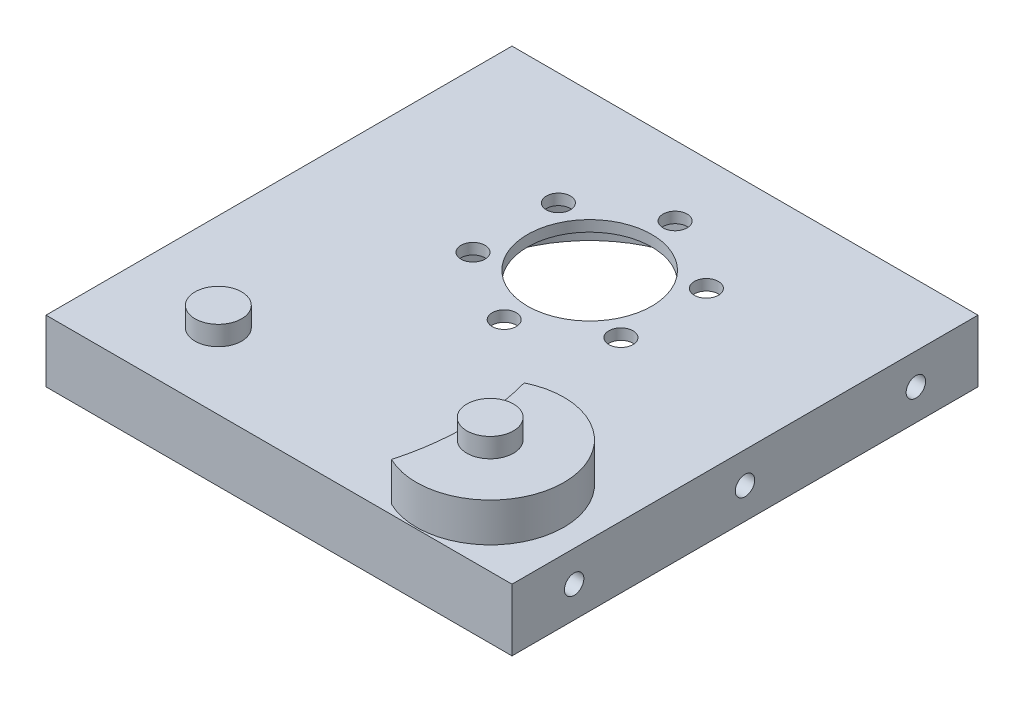
ISO-10303-21;
HEADER;
FILE_DESCRIPTION(('STEP AP214'),'2;1');
FILE_NAME('part.step','',(''),(''),'','','');
FILE_SCHEMA(('AUTOMOTIVE_DESIGN { 1 0 10303 214 1 1 1 1 }'));
ENDSEC;
DATA;
#1=APPLICATION_CONTEXT('core data for automotive mechanical design processes');
#2=APPLICATION_PROTOCOL_DEFINITION('international standard','automotive_design',2000,#1);
#3=PRODUCT_CONTEXT('',#1,'mechanical');
#4=PRODUCT('Part','Part','',(#3));
#5=PRODUCT_RELATED_PRODUCT_CATEGORY('part','',(#4));
#6=PRODUCT_DEFINITION_FORMATION('','',#4);
#7=PRODUCT_DEFINITION_CONTEXT('part definition',#1,'design');
#8=PRODUCT_DEFINITION('design','',#6,#7);
#9=PRODUCT_DEFINITION_SHAPE('','',#8);
#10=(LENGTH_UNIT() NAMED_UNIT(*) SI_UNIT(.MILLI.,.METRE.));
#11=(NAMED_UNIT(*) PLANE_ANGLE_UNIT() SI_UNIT($,.RADIAN.));
#12=(NAMED_UNIT(*) SI_UNIT($,.STERADIAN.) SOLID_ANGLE_UNIT());
#13=UNCERTAINTY_MEASURE_WITH_UNIT(LENGTH_MEASURE(1.E-05),#10,'distance_accuracy_value','');
#14=(GEOMETRIC_REPRESENTATION_CONTEXT(3) GLOBAL_UNCERTAINTY_ASSIGNED_CONTEXT((#13)) GLOBAL_UNIT_ASSIGNED_CONTEXT((#10,
#11,#12)) REPRESENTATION_CONTEXT('',''));
#15=CARTESIAN_POINT('',(0.,0.,0.));
#16=DIRECTION('',(0.,0.,1.));
#17=DIRECTION('',(1.,0.,0.));
#18=AXIS2_PLACEMENT_3D('',#15,#16,#17);
#19=CARTESIAN_POINT('',(0.,8.,-10.));
#20=DIRECTION('',(0.,-1.,0.));
#21=DIRECTION('',(0.,0.,-1.));
#22=AXIS2_PLACEMENT_3D('',#19,#20,#21);
#23=CYLINDRICAL_SURFACE('',#22,16.);
#24=CARTESIAN_POINT('',(0.,0.,-10.));
#25=DIRECTION('',(0.,1.,0.));
#26=DIRECTION('',(0.,0.,1.));
#27=AXIS2_PLACEMENT_3D('',#24,#25,#26);
#28=CIRCLE('',#27,16.);
#29=CARTESIAN_POINT('',(0.,0.,5.99999999999999));
#30=VERTEX_POINT('',#29);
#31=EDGE_CURVE('E245',#30,#30,#28,.T.);
#32=ORIENTED_EDGE('',*,*,#31,.F.);
#33=EDGE_LOOP('',(#32));
#34=FACE_BOUND('',#33,.T.);
#35=CARTESIAN_POINT('',(0.,6.6,-10.));
#36=DIRECTION('',(0.,1.,0.));
#37=DIRECTION('',(0.,0.,1.));
#38=AXIS2_PLACEMENT_3D('',#35,#36,#37);
#39=CIRCLE('',#38,16.);
#40=CARTESIAN_POINT('',(0.,6.6,5.99999999999998));
#41=VERTEX_POINT('',#40);
#42=EDGE_CURVE('E210',#41,#41,#39,.T.);
#43=ORIENTED_EDGE('',*,*,#42,.T.);
#44=EDGE_LOOP('',(#43));
#45=FACE_BOUND('',#44,.T.);
#46=ADVANCED_FACE('F45',(#34,#45),#23,.F.);
#47=CARTESIAN_POINT('',(0.,8.,0.));
#48=DIRECTION('',(0.,1.,0.));
#49=DIRECTION('',(0.,0.,1.));
#50=AXIS2_PLACEMENT_3D('',#47,#48,#49);
#51=PLANE('',#50);
#52=CARTESIAN_POINT('',(9.52627944162876,8.,-15.5000000000001));
#53=DIRECTION('',(0.,1.,0.));
#54=DIRECTION('',(-0.866025403784433,0.,0.50000000000001));
#55=AXIS2_PLACEMENT_3D('',#52,#53,#54);
#56=CIRCLE('',#55,1.55);
#57=CARTESIAN_POINT('',(8.18394006576289,8.,-14.7250000000001));
#58=VERTEX_POINT('',#57);
#59=EDGE_CURVE('E180',#58,#58,#56,.T.);
#60=ORIENTED_EDGE('',*,*,#59,.F.);
#61=EDGE_LOOP('',(#60));
#62=FACE_BOUND('',#61,.T.);
#63=CARTESIAN_POINT('',(9.52627944162887,8.,-4.50000000000009));
#64=DIRECTION('',(0.,1.,0.));
#65=DIRECTION('',(-0.866025403784443,0.,-0.499999999999992));
#66=AXIS2_PLACEMENT_3D('',#63,#64,#65);
#67=CIRCLE('',#66,1.55);
#68=CARTESIAN_POINT('',(8.18394006576298,8.,-5.27500000000007));
#69=VERTEX_POINT('',#68);
#70=EDGE_CURVE('E190',#69,#69,#67,.T.);
#71=ORIENTED_EDGE('',*,*,#70,.F.);
#72=EDGE_LOOP('',(#71));
#73=FACE_BOUND('',#72,.T.);
#74=CARTESIAN_POINT('',(0.,8.,0.999999999999994));
#75=DIRECTION('',(0.,1.,0.));
#76=DIRECTION('',(0.,0.,-1.));
#77=AXIS2_PLACEMENT_3D('',#74,#75,#76);
#78=CIRCLE('',#77,1.55);
#79=CARTESIAN_POINT('',(0.,8.,-0.550000000000005));
#80=VERTEX_POINT('',#79);
#81=EDGE_CURVE('E186',#80,#80,#78,.T.);
#82=ORIENTED_EDGE('',*,*,#81,.F.);
#83=EDGE_LOOP('',(#82));
#84=FACE_BOUND('',#83,.T.);
#85=CARTESIAN_POINT('',(-9.52627944162881,8.,-4.49999999999997));
#86=DIRECTION('',(0.,1.,0.));
#87=DIRECTION('',(0.866025403784436,0.,-0.500000000000004));
#88=AXIS2_PLACEMENT_3D('',#85,#86,#87);
#89=CIRCLE('',#88,1.55);
#90=CARTESIAN_POINT('',(-8.18394006576294,8.,-5.27499999999997));
#91=VERTEX_POINT('',#90);
#92=EDGE_CURVE('E181',#91,#91,#89,.T.);
#93=ORIENTED_EDGE('',*,*,#92,.F.);
#94=EDGE_LOOP('',(#93));
#95=FACE_BOUND('',#94,.T.);
#96=CARTESIAN_POINT('',(-9.52627944162884,8.,-15.5));
#97=DIRECTION('',(0.,1.,0.));
#98=DIRECTION('',(0.86602540378444,0.,0.499999999999998));
#99=AXIS2_PLACEMENT_3D('',#96,#97,#98);
#100=CIRCLE('',#99,1.55);
#101=CARTESIAN_POINT('',(-8.18394006576296,8.,-14.725));
#102=VERTEX_POINT('',#101);
#103=EDGE_CURVE('E185',#102,#102,#100,.T.);
#104=ORIENTED_EDGE('',*,*,#103,.F.);
#105=EDGE_LOOP('',(#104));
#106=FACE_BOUND('',#105,.T.);
#107=CARTESIAN_POINT('',(0.,8.,-21.));
#108=DIRECTION('',(0.,1.,0.));
#109=DIRECTION('',(0.,0.,1.));
#110=AXIS2_PLACEMENT_3D('',#107,#108,#109);
#111=CIRCLE('',#110,1.55);
#112=CARTESIAN_POINT('',(0.,8.,-19.45));
#113=VERTEX_POINT('',#112);
#114=EDGE_CURVE('E201',#113,#113,#111,.T.);
#115=ORIENTED_EDGE('',*,*,#114,.F.);
#116=EDGE_LOOP('',(#115));
#117=FACE_BOUND('',#116,.T.);
#118=CARTESIAN_POINT('',(17.5,8.,20.3108891324554));
#119=DIRECTION('',(0.,1.,0.));
#120=DIRECTION('',(0.,0.,1.));
#121=AXIS2_PLACEMENT_3D('',#118,#119,#120);
#122=CIRCLE('',#121,9.5);
#123=CARTESIAN_POINT('',(13.3392857142857,8.,28.8512905652132));
#124=VERTEX_POINT('',#123);
#125=CARTESIAN_POINT('',(13.3392857142857,8.,11.7704876996975));
#126=VERTEX_POINT('',#125);
#127=EDGE_CURVE('E228',#124,#126,#122,.T.);
#128=ORIENTED_EDGE('',*,*,#127,.F.);
#129=CARTESIAN_POINT('',(-17.5,8.,20.3108891324554));
#130=DIRECTION('',(0.,-1.,0.));
#131=DIRECTION('',(0.,0.,1.));
#132=AXIS2_PLACEMENT_3D('',#129,#130,#131);
#133=CIRCLE('',#132,32.);
#134=EDGE_CURVE('E218',#126,#124,#133,.T.);
#135=ORIENTED_EDGE('',*,*,#134,.F.);
#136=EDGE_LOOP('',(#128,#135));
#137=FACE_BOUND('',#136,.T.);
#138=CARTESIAN_POINT('',(-17.5,8.,20.3108891324554));
#139=DIRECTION('',(0.,1.,0.));
#140=DIRECTION('',(0.,0.,1.));
#141=AXIS2_PLACEMENT_3D('',#138,#139,#140);
#142=CIRCLE('',#141,3.);
#143=CARTESIAN_POINT('',(-17.5,8.,23.3108891324554));
#144=VERTEX_POINT('',#143);
#145=EDGE_CURVE('E240',#144,#144,#142,.T.);
#146=ORIENTED_EDGE('',*,*,#145,.F.);
#147=EDGE_LOOP('',(#146));
#148=FACE_BOUND('',#147,.T.);
#149=DIRECTION('',(0.,0.,-1.));
#150=VECTOR('',#149,1.);
#151=CARTESIAN_POINT('',(30.,8.,-30.));
#152=LINE('',#151,#150);
#153=CARTESIAN_POINT('',(30.,8.,30.));
#154=VERTEX_POINT('',#153);
#155=CARTESIAN_POINT('',(30.,8.,-30.));
#156=VERTEX_POINT('',#155);
#157=EDGE_CURVE('E253',#154,#156,#152,.T.);
#158=ORIENTED_EDGE('',*,*,#157,.T.);
#159=DIRECTION('',(-1.,0.,0.));
#160=VECTOR('',#159,1.);
#161=CARTESIAN_POINT('',(-30.,8.,-30.));
#162=LINE('',#161,#160);
#163=CARTESIAN_POINT('',(-30.,8.,-30.));
#164=VERTEX_POINT('',#163);
#165=EDGE_CURVE('E257',#156,#164,#162,.T.);
#166=ORIENTED_EDGE('',*,*,#165,.T.);
#167=DIRECTION('',(0.,0.,1.));
#168=VECTOR('',#167,1.);
#169=CARTESIAN_POINT('',(-30.,8.,-30.));
#170=LINE('',#169,#168);
#171=CARTESIAN_POINT('',(-30.,8.,30.));
#172=VERTEX_POINT('',#171);
#173=EDGE_CURVE('E261',#164,#172,#170,.T.);
#174=ORIENTED_EDGE('',*,*,#173,.T.);
#175=DIRECTION('',(1.,0.,0.));
#176=VECTOR('',#175,1.);
#177=CARTESIAN_POINT('',(-30.,8.,30.));
#178=LINE('',#177,#176);
#179=EDGE_CURVE('E264',#172,#154,#178,.T.);
#180=ORIENTED_EDGE('',*,*,#179,.T.);
#181=EDGE_LOOP('',(#158,#166,#174,#180));
#182=FACE_BOUND('',#181,.T.);
#183=CARTESIAN_POINT('',(0.,8.,-10.));
#184=DIRECTION('',(0.,1.,0.));
#185=DIRECTION('',(0.,0.,1.));
#186=AXIS2_PLACEMENT_3D('',#183,#184,#185);
#187=CIRCLE('',#186,8.);
#188=CARTESIAN_POINT('',(0.,8.,-2.00000000000001));
#189=VERTEX_POINT('',#188);
#190=EDGE_CURVE('E211',#189,#189,#187,.T.);
#191=ORIENTED_EDGE('',*,*,#190,.F.);
#192=EDGE_LOOP('',(#191));
#193=FACE_BOUND('',#192,.T.);
#194=ADVANCED_FACE('F335',(#62,#73,#84,#95,#106,#117,#137,#148,#182,#193),#51,.T.);
#195=CARTESIAN_POINT('',(0.,0.,0.));
#196=DIRECTION('',(0.,1.,0.));
#197=DIRECTION('',(0.,0.,1.));
#198=AXIS2_PLACEMENT_3D('',#195,#196,#197);
#199=PLANE('',#198);
#200=DIRECTION('',(0.,0.,-1.));
#201=VECTOR('',#200,1.);
#202=CARTESIAN_POINT('',(30.,0.,-30.));
#203=LINE('',#202,#201);
#204=CARTESIAN_POINT('',(30.,0.,30.));
#205=VERTEX_POINT('',#204);
#206=CARTESIAN_POINT('',(30.,0.,-30.));
#207=VERTEX_POINT('',#206);
#208=EDGE_CURVE('E252',#205,#207,#203,.T.);
#209=ORIENTED_EDGE('',*,*,#208,.F.);
#210=DIRECTION('',(1.,0.,0.));
#211=VECTOR('',#210,1.);
#212=CARTESIAN_POINT('',(-30.,0.,30.));
#213=LINE('',#212,#211);
#214=CARTESIAN_POINT('',(-30.,0.,30.));
#215=VERTEX_POINT('',#214);
#216=EDGE_CURVE('E258',#215,#205,#213,.T.);
#217=ORIENTED_EDGE('',*,*,#216,.F.);
#218=DIRECTION('',(0.,0.,1.));
#219=VECTOR('',#218,1.);
#220=CARTESIAN_POINT('',(-30.,0.,-30.));
#221=LINE('',#220,#219);
#222=CARTESIAN_POINT('',(-30.,0.,-30.));
#223=VERTEX_POINT('',#222);
#224=EDGE_CURVE('E274',#223,#215,#221,.T.);
#225=ORIENTED_EDGE('',*,*,#224,.F.);
#226=DIRECTION('',(-1.,0.,0.));
#227=VECTOR('',#226,1.);
#228=CARTESIAN_POINT('',(-30.,0.,-30.));
#229=LINE('',#228,#227);
#230=EDGE_CURVE('E271',#207,#223,#229,.T.);
#231=ORIENTED_EDGE('',*,*,#230,.F.);
#232=EDGE_LOOP('',(#209,#217,#225,#231));
#233=FACE_BOUND('',#232,.T.);
#234=ORIENTED_EDGE('',*,*,#31,.T.);
#235=EDGE_LOOP('',(#234));
#236=FACE_BOUND('',#235,.T.);
#237=ADVANCED_FACE('F341',(#233,#236),#199,.F.);
#238=CARTESIAN_POINT('',(30.,8.,-30.));
#239=DIRECTION('',(-1.,0.,0.));
#240=DIRECTION('',(0.,0.,1.));
#241=AXIS2_PLACEMENT_3D('',#238,#239,#240);
#242=PLANE('',#241);
#243=CARTESIAN_POINT('',(30.,4.,22.));
#244=DIRECTION('',(1.,0.,0.));
#245=DIRECTION('',(0.,0.,-1.));
#246=AXIS2_PLACEMENT_3D('',#243,#244,#245);
#247=CIRCLE('',#246,1.25);
#248=CARTESIAN_POINT('',(30.,4.,20.75));
#249=VERTEX_POINT('',#248);
#250=EDGE_CURVE('E156',#249,#249,#247,.T.);
#251=ORIENTED_EDGE('',*,*,#250,.F.);
#252=EDGE_LOOP('',(#251));
#253=FACE_BOUND('',#252,.T.);
#254=CARTESIAN_POINT('',(30.,4.,0.));
#255=DIRECTION('',(1.,0.,0.));
#256=DIRECTION('',(0.,0.,-1.));
#257=AXIS2_PLACEMENT_3D('',#254,#255,#256);
#258=CIRCLE('',#257,1.25);
#259=CARTESIAN_POINT('',(30.,4.,-1.25));
#260=VERTEX_POINT('',#259);
#261=EDGE_CURVE('E164',#260,#260,#258,.T.);
#262=ORIENTED_EDGE('',*,*,#261,.F.);
#263=EDGE_LOOP('',(#262));
#264=FACE_BOUND('',#263,.T.);
#265=CARTESIAN_POINT('',(30.,4.,-22.));
#266=DIRECTION('',(1.,0.,0.));
#267=DIRECTION('',(0.,0.,-1.));
#268=AXIS2_PLACEMENT_3D('',#265,#266,#267);
#269=CIRCLE('',#268,1.25);
#270=CARTESIAN_POINT('',(30.,4.,-23.25));
#271=VERTEX_POINT('',#270);
#272=EDGE_CURVE('E172',#271,#271,#269,.T.);
#273=ORIENTED_EDGE('',*,*,#272,.F.);
#274=EDGE_LOOP('',(#273));
#275=FACE_BOUND('',#274,.T.);
#276=ORIENTED_EDGE('',*,*,#208,.T.);
#277=DIRECTION('',(0.,-1.,0.));
#278=VECTOR('',#277,1.);
#279=CARTESIAN_POINT('',(30.,8.,-30.));
#280=LINE('',#279,#278);
#281=EDGE_CURVE('E55',#156,#207,#280,.T.);
#282=ORIENTED_EDGE('',*,*,#281,.F.);
#283=ORIENTED_EDGE('',*,*,#157,.F.);
#284=DIRECTION('',(0.,-1.,0.));
#285=VECTOR('',#284,1.);
#286=CARTESIAN_POINT('',(30.,8.,30.));
#287=LINE('',#286,#285);
#288=EDGE_CURVE('E267',#154,#205,#287,.T.);
#289=ORIENTED_EDGE('',*,*,#288,.T.);
#290=EDGE_LOOP('',(#276,#282,#283,#289));
#291=FACE_BOUND('',#290,.T.);
#292=ADVANCED_FACE('F47',(#253,#264,#275,#291),#242,.F.);
#293=CARTESIAN_POINT('',(-30.,8.,-30.));
#294=DIRECTION('',(0.,0.,1.));
#295=DIRECTION('',(1.,0.,0.));
#296=AXIS2_PLACEMENT_3D('',#293,#294,#295);
#297=PLANE('',#296);
#298=ORIENTED_EDGE('',*,*,#230,.T.);
#299=DIRECTION('',(0.,-1.,0.));
#300=VECTOR('',#299,1.);
#301=CARTESIAN_POINT('',(-30.,8.,-30.));
#302=LINE('',#301,#300);
#303=EDGE_CURVE('E286',#164,#223,#302,.T.);
#304=ORIENTED_EDGE('',*,*,#303,.F.);
#305=ORIENTED_EDGE('',*,*,#165,.F.);
#306=ORIENTED_EDGE('',*,*,#281,.T.);
#307=EDGE_LOOP('',(#298,#304,#305,#306));
#308=FACE_BOUND('',#307,.T.);
#309=ADVANCED_FACE('F359',(#308),#297,.F.);
#310=CARTESIAN_POINT('',(-30.,8.,-30.));
#311=DIRECTION('',(1.,0.,0.));
#312=DIRECTION('',(0.,0.,-1.));
#313=AXIS2_PLACEMENT_3D('',#310,#311,#312);
#314=PLANE('',#313);
#315=CARTESIAN_POINT('',(-30.,4.,22.));
#316=DIRECTION('',(-1.,0.,0.));
#317=DIRECTION('',(0.,0.,1.));
#318=AXIS2_PLACEMENT_3D('',#315,#316,#317);
#319=CIRCLE('',#318,1.25);
#320=CARTESIAN_POINT('',(-30.,4.,23.25));
#321=VERTEX_POINT('',#320);
#322=EDGE_CURVE('E135',#321,#321,#319,.T.);
#323=ORIENTED_EDGE('',*,*,#322,.F.);
#324=EDGE_LOOP('',(#323));
#325=FACE_BOUND('',#324,.T.);
#326=CARTESIAN_POINT('',(-30.,4.,0.));
#327=DIRECTION('',(-1.,0.,0.));
#328=DIRECTION('',(0.,0.,1.));
#329=AXIS2_PLACEMENT_3D('',#326,#327,#328);
#330=CIRCLE('',#329,1.25);
#331=CARTESIAN_POINT('',(-30.,4.,1.25));
#332=VERTEX_POINT('',#331);
#333=EDGE_CURVE('E134',#332,#332,#330,.T.);
#334=ORIENTED_EDGE('',*,*,#333,.F.);
#335=EDGE_LOOP('',(#334));
#336=FACE_BOUND('',#335,.T.);
#337=CARTESIAN_POINT('',(-30.,4.,-22.));
#338=DIRECTION('',(-1.,0.,0.));
#339=DIRECTION('',(0.,0.,1.));
#340=AXIS2_PLACEMENT_3D('',#337,#338,#339);
#341=CIRCLE('',#340,1.25);
#342=CARTESIAN_POINT('',(-30.,4.,-20.75));
#343=VERTEX_POINT('',#342);
#344=EDGE_CURVE('E148',#343,#343,#341,.T.);
#345=ORIENTED_EDGE('',*,*,#344,.F.);
#346=EDGE_LOOP('',(#345));
#347=FACE_BOUND('',#346,.T.);
#348=ORIENTED_EDGE('',*,*,#224,.T.);
#349=DIRECTION('',(0.,-1.,0.));
#350=VECTOR('',#349,1.);
#351=CARTESIAN_POINT('',(-30.,8.,30.));
#352=LINE('',#351,#350);
#353=EDGE_CURVE('E282',#172,#215,#352,.T.);
#354=ORIENTED_EDGE('',*,*,#353,.F.);
#355=ORIENTED_EDGE('',*,*,#173,.F.);
#356=ORIENTED_EDGE('',*,*,#303,.T.);
#357=EDGE_LOOP('',(#348,#354,#355,#356));
#358=FACE_BOUND('',#357,.T.);
#359=ADVANCED_FACE('F356',(#325,#336,#347,#358),#314,.F.);
#360=CARTESIAN_POINT('',(-30.,8.,30.));
#361=DIRECTION('',(0.,0.,-1.));
#362=DIRECTION('',(-1.,0.,0.));
#363=AXIS2_PLACEMENT_3D('',#360,#361,#362);
#364=PLANE('',#363);
#365=ORIENTED_EDGE('',*,*,#216,.T.);
#366=ORIENTED_EDGE('',*,*,#288,.F.);
#367=ORIENTED_EDGE('',*,*,#179,.F.);
#368=ORIENTED_EDGE('',*,*,#353,.T.);
#369=EDGE_LOOP('',(#365,#366,#367,#368));
#370=FACE_BOUND('',#369,.T.);
#371=ADVANCED_FACE('F353',(#370),#364,.F.);
#372=CARTESIAN_POINT('',(-17.5,10.5,20.3108891324554));
#373=DIRECTION('',(0.,-1.,0.));
#374=DIRECTION('',(0.,0.,-1.));
#375=AXIS2_PLACEMENT_3D('',#372,#373,#374);
#376=CYLINDRICAL_SURFACE('',#375,3.);
#377=CARTESIAN_POINT('',(-17.5,10.5,20.3108891324554));
#378=DIRECTION('',(0.,1.,0.));
#379=DIRECTION('',(0.,0.,1.));
#380=AXIS2_PLACEMENT_3D('',#377,#378,#379);
#381=CIRCLE('',#380,3.);
#382=CARTESIAN_POINT('',(-17.5,10.5,23.3108891324554));
#383=VERTEX_POINT('',#382);
#384=EDGE_CURVE('E241',#383,#383,#381,.T.);
#385=ORIENTED_EDGE('',*,*,#384,.F.);
#386=EDGE_LOOP('',(#385));
#387=FACE_BOUND('',#386,.T.);
#388=ORIENTED_EDGE('',*,*,#145,.T.);
#389=EDGE_LOOP('',(#388));
#390=FACE_BOUND('',#389,.T.);
#391=ADVANCED_FACE('F347',(#387,#390),#376,.T.);
#392=CARTESIAN_POINT('',(-17.5,10.5,20.3108891324554));
#393=DIRECTION('',(0.,1.,0.));
#394=DIRECTION('',(0.,0.,1.));
#395=AXIS2_PLACEMENT_3D('',#392,#393,#394);
#396=PLANE('',#395);
#397=ORIENTED_EDGE('',*,*,#384,.T.);
#398=EDGE_LOOP('',(#397));
#399=FACE_BOUND('',#398,.T.);
#400=ADVANCED_FACE('F410',(#399),#396,.T.);
#401=CARTESIAN_POINT('',(-17.5,13.,20.3108891324554));
#402=DIRECTION('',(0.,-1.,0.));
#403=DIRECTION('',(0.,0.,-1.));
#404=AXIS2_PLACEMENT_3D('',#401,#402,#403);
#405=CYLINDRICAL_SURFACE('',#404,32.);
#406=CARTESIAN_POINT('',(-17.5,13.,20.3108891324554));
#407=DIRECTION('',(0.,-1.,0.));
#408=DIRECTION('',(0.,0.,1.));
#409=AXIS2_PLACEMENT_3D('',#406,#407,#408);
#410=CIRCLE('',#409,32.);
#411=CARTESIAN_POINT('',(14.5,13.,20.3108891324554));
#412=VERTEX_POINT('',#411);
#413=CARTESIAN_POINT('',(13.3392857142857,13.,28.8512905652132));
#414=VERTEX_POINT('',#413);
#415=EDGE_CURVE('E222',#412,#414,#410,.T.);
#416=ORIENTED_EDGE('',*,*,#415,.F.);
#417=CARTESIAN_POINT('',(13.3392857142857,13.,11.7704876996975));
#418=VERTEX_POINT('',#417);
#419=EDGE_CURVE('E71',#418,#412,#410,.T.);
#420=ORIENTED_EDGE('',*,*,#419,.F.);
#421=DIRECTION('',(0.,-1.,0.));
#422=VECTOR('',#421,1.);
#423=CARTESIAN_POINT('',(13.3392857142857,13.,11.7704876996975));
#424=LINE('',#423,#422);
#425=EDGE_CURVE('E225',#418,#126,#424,.T.);
#426=ORIENTED_EDGE('',*,*,#425,.T.);
#427=ORIENTED_EDGE('',*,*,#134,.T.);
#428=DIRECTION('',(0.,-1.,0.));
#429=VECTOR('',#428,1.);
#430=CARTESIAN_POINT('',(13.3392857142857,13.,28.8512905652132));
#431=LINE('',#430,#429);
#432=EDGE_CURVE('E63',#414,#124,#431,.T.);
#433=ORIENTED_EDGE('',*,*,#432,.F.);
#434=EDGE_LOOP('',(#416,#420,#426,#427,#433));
#435=FACE_BOUND('',#434,.T.);
#436=ADVANCED_FACE('F407',(#435),#405,.F.);
#437=CARTESIAN_POINT('',(17.5,13.,20.3108891324554));
#438=DIRECTION('',(0.,-1.,0.));
#439=DIRECTION('',(0.,0.,-1.));
#440=AXIS2_PLACEMENT_3D('',#437,#438,#439);
#441=CYLINDRICAL_SURFACE('',#440,9.5);
#442=ORIENTED_EDGE('',*,*,#127,.T.);
#443=ORIENTED_EDGE('',*,*,#425,.F.);
#444=CARTESIAN_POINT('',(17.5,13.,20.3108891324554));
#445=DIRECTION('',(0.,1.,0.));
#446=DIRECTION('',(0.,0.,1.));
#447=AXIS2_PLACEMENT_3D('',#444,#445,#446);
#448=CIRCLE('',#447,9.5);
#449=EDGE_CURVE('E221',#414,#418,#448,.T.);
#450=ORIENTED_EDGE('',*,*,#449,.F.);
#451=ORIENTED_EDGE('',*,*,#432,.T.);
#452=EDGE_LOOP('',(#442,#443,#450,#451));
#453=FACE_BOUND('',#452,.T.);
#454=ADVANCED_FACE('F404',(#453),#441,.T.);
#455=CARTESIAN_POINT('',(0.,13.,20.3108891324554));
#456=DIRECTION('',(0.,1.,0.));
#457=DIRECTION('',(0.,0.,1.));
#458=AXIS2_PLACEMENT_3D('',#455,#456,#457);
#459=PLANE('',#458);
#460=ORIENTED_EDGE('',*,*,#419,.T.);
#461=CARTESIAN_POINT('',(17.5,13.,20.3108891324554));
#462=DIRECTION('',(0.,1.,0.));
#463=DIRECTION('',(0.,0.,1.));
#464=AXIS2_PLACEMENT_3D('',#461,#462,#463);
#465=CIRCLE('',#464,2.99999999999999);
#466=EDGE_CURVE('E11',#412,#412,#465,.T.);
#467=ORIENTED_EDGE('',*,*,#466,.F.);
#468=ORIENTED_EDGE('',*,*,#415,.T.);
#469=ORIENTED_EDGE('',*,*,#449,.T.);
#470=EDGE_LOOP('',(#460,#467,#468,#469));
#471=FACE_BOUND('',#470,.T.);
#472=ADVANCED_FACE('F400',(#471),#459,.T.);
#473=CARTESIAN_POINT('',(17.5,15.5,20.3108891324554));
#474=DIRECTION('',(0.,1.,0.));
#475=DIRECTION('',(0.,0.,1.));
#476=AXIS2_PLACEMENT_3D('',#473,#474,#475);
#477=PLANE('',#476);
#478=CARTESIAN_POINT('',(17.5,15.5,20.3108891324554));
#479=DIRECTION('',(0.,1.,0.));
#480=DIRECTION('',(0.,0.,1.));
#481=AXIS2_PLACEMENT_3D('',#478,#479,#480);
#482=CIRCLE('',#481,2.99999999999999);
#483=CARTESIAN_POINT('',(17.5,15.5,23.3108891324553));
#484=VERTEX_POINT('',#483);
#485=EDGE_CURVE('E236',#484,#484,#482,.T.);
#486=ORIENTED_EDGE('',*,*,#485,.T.);
#487=EDGE_LOOP('',(#486));
#488=FACE_BOUND('',#487,.T.);
#489=ADVANCED_FACE('F403',(#488),#477,.T.);
#490=CARTESIAN_POINT('',(17.5,10.5,20.3108891324554));
#491=DIRECTION('',(0.,-1.,0.));
#492=DIRECTION('',(0.,0.,-1.));
#493=AXIS2_PLACEMENT_3D('',#490,#491,#492);
#494=CYLINDRICAL_SURFACE('',#493,2.99999999999999);
#495=ORIENTED_EDGE('',*,*,#466,.T.);
#496=EDGE_LOOP('',(#495));
#497=FACE_BOUND('',#496,.T.);
#498=ORIENTED_EDGE('',*,*,#485,.F.);
#499=EDGE_LOOP('',(#498));
#500=FACE_BOUND('',#499,.T.);
#501=ADVANCED_FACE('F396',(#497,#500),#494,.T.);
#502=CARTESIAN_POINT('',(0.,6.6,-10.));
#503=DIRECTION('',(0.,1.,0.));
#504=DIRECTION('',(0.,0.,1.));
#505=AXIS2_PLACEMENT_3D('',#502,#503,#504);
#506=PLANE('',#505);
#507=CARTESIAN_POINT('',(9.52627944162876,6.6,-15.5000000000001));
#508=DIRECTION('',(0.,1.,0.));
#509=DIRECTION('',(0.,0.,1.));
#510=AXIS2_PLACEMENT_3D('',#507,#508,#509);
#511=CIRCLE('',#510,1.55);
#512=CARTESIAN_POINT('',(9.52627944162876,6.6,-13.9500000000001));
#513=VERTEX_POINT('',#512);
#514=EDGE_CURVE('E49',#513,#513,#511,.T.);
#515=ORIENTED_EDGE('',*,*,#514,.T.);
#516=EDGE_LOOP('',(#515));
#517=FACE_BOUND('',#516,.T.);
#518=CARTESIAN_POINT('',(9.52627944162887,6.6,-4.50000000000009));
#519=DIRECTION('',(0.,1.,0.));
#520=DIRECTION('',(0.,0.,1.));
#521=AXIS2_PLACEMENT_3D('',#518,#519,#520);
#522=CIRCLE('',#521,1.55);
#523=CARTESIAN_POINT('',(9.52627944162887,6.6,-2.95000000000009));
#524=VERTEX_POINT('',#523);
#525=EDGE_CURVE('E306',#524,#524,#522,.T.);
#526=ORIENTED_EDGE('',*,*,#525,.T.);
#527=EDGE_LOOP('',(#526));
#528=FACE_BOUND('',#527,.T.);
#529=CARTESIAN_POINT('',(0.,6.6,0.999999999999994));
#530=DIRECTION('',(0.,1.,0.));
#531=DIRECTION('',(0.,0.,1.));
#532=AXIS2_PLACEMENT_3D('',#529,#530,#531);
#533=CIRCLE('',#532,1.55);
#534=CARTESIAN_POINT('',(0.,6.6,2.54999999999999));
#535=VERTEX_POINT('',#534);
#536=EDGE_CURVE('E303',#535,#535,#533,.T.);
#537=ORIENTED_EDGE('',*,*,#536,.T.);
#538=EDGE_LOOP('',(#537));
#539=FACE_BOUND('',#538,.T.);
#540=CARTESIAN_POINT('',(-9.52627944162881,6.6,-4.49999999999997));
#541=DIRECTION('',(0.,1.,0.));
#542=DIRECTION('',(0.,0.,1.));
#543=AXIS2_PLACEMENT_3D('',#540,#541,#542);
#544=CIRCLE('',#543,1.55);
#545=CARTESIAN_POINT('',(-9.52627944162881,6.6,-2.94999999999997));
#546=VERTEX_POINT('',#545);
#547=EDGE_CURVE('E299',#546,#546,#544,.T.);
#548=ORIENTED_EDGE('',*,*,#547,.T.);
#549=EDGE_LOOP('',(#548));
#550=FACE_BOUND('',#549,.T.);
#551=CARTESIAN_POINT('',(-9.52627944162884,6.6,-15.5));
#552=DIRECTION('',(0.,1.,0.));
#553=DIRECTION('',(0.,0.,1.));
#554=AXIS2_PLACEMENT_3D('',#551,#552,#553);
#555=CIRCLE('',#554,1.55);
#556=CARTESIAN_POINT('',(-9.52627944162884,6.6,-13.95));
#557=VERTEX_POINT('',#556);
#558=EDGE_CURVE('E200',#557,#557,#555,.T.);
#559=ORIENTED_EDGE('',*,*,#558,.T.);
#560=EDGE_LOOP('',(#559));
#561=FACE_BOUND('',#560,.T.);
#562=CARTESIAN_POINT('',(0.,6.6,-21.));
#563=DIRECTION('',(0.,1.,0.));
#564=DIRECTION('',(0.,0.,1.));
#565=AXIS2_PLACEMENT_3D('',#562,#563,#564);
#566=CIRCLE('',#565,1.55);
#567=CARTESIAN_POINT('',(0.,6.6,-19.45));
#568=VERTEX_POINT('',#567);
#569=EDGE_CURVE('E205',#568,#568,#566,.T.);
#570=ORIENTED_EDGE('',*,*,#569,.T.);
#571=EDGE_LOOP('',(#570));
#572=FACE_BOUND('',#571,.T.);
#573=CARTESIAN_POINT('',(0.,6.6,-10.));
#574=DIRECTION('',(0.,1.,0.));
#575=DIRECTION('',(0.,0.,1.));
#576=AXIS2_PLACEMENT_3D('',#573,#574,#575);
#577=CIRCLE('',#576,8.);
#578=CARTESIAN_POINT('',(0.,6.6,-2.00000000000001));
#579=VERTEX_POINT('',#578);
#580=EDGE_CURVE('E206',#579,#579,#577,.T.);
#581=ORIENTED_EDGE('',*,*,#580,.T.);
#582=EDGE_LOOP('',(#581));
#583=FACE_BOUND('',#582,.T.);
#584=ORIENTED_EDGE('',*,*,#42,.F.);
#585=EDGE_LOOP('',(#584));
#586=FACE_BOUND('',#585,.T.);
#587=ADVANCED_FACE('F315',(#517,#528,#539,#550,#561,#572,#583,#586),#506,.F.);
#588=CARTESIAN_POINT('',(0.,6.6,-10.));
#589=DIRECTION('',(0.,1.,0.));
#590=DIRECTION('',(0.,0.,1.));
#591=AXIS2_PLACEMENT_3D('',#588,#589,#590);
#592=CYLINDRICAL_SURFACE('',#591,8.);
#593=ORIENTED_EDGE('',*,*,#580,.F.);
#594=EDGE_LOOP('',(#593));
#595=FACE_BOUND('',#594,.T.);
#596=ORIENTED_EDGE('',*,*,#190,.T.);
#597=EDGE_LOOP('',(#596));
#598=FACE_BOUND('',#597,.T.);
#599=ADVANCED_FACE('F384',(#595,#598),#592,.F.);
#600=CARTESIAN_POINT('',(0.,0.,-21.));
#601=DIRECTION('',(0.,1.,0.));
#602=DIRECTION('',(0.,0.,1.));
#603=AXIS2_PLACEMENT_3D('',#600,#601,#602);
#604=CYLINDRICAL_SURFACE('',#603,1.55);
#605=ORIENTED_EDGE('',*,*,#114,.T.);
#606=EDGE_LOOP('',(#605));
#607=FACE_BOUND('',#606,.T.);
#608=ORIENTED_EDGE('',*,*,#569,.F.);
#609=EDGE_LOOP('',(#608));
#610=FACE_BOUND('',#609,.T.);
#611=ADVANCED_FACE('F386',(#607,#610),#604,.F.);
#612=CARTESIAN_POINT('',(-9.52627944162884,0.,-15.5));
#613=DIRECTION('',(0.,1.,0.));
#614=DIRECTION('',(0.,0.,1.));
#615=AXIS2_PLACEMENT_3D('',#612,#613,#614);
#616=CYLINDRICAL_SURFACE('',#615,1.55);
#617=ORIENTED_EDGE('',*,*,#103,.T.);
#618=EDGE_LOOP('',(#617));
#619=FACE_BOUND('',#618,.T.);
#620=ORIENTED_EDGE('',*,*,#558,.F.);
#621=EDGE_LOOP('',(#620));
#622=FACE_BOUND('',#621,.T.);
#623=ADVANCED_FACE('F393',(#619,#622),#616,.F.);
#624=CARTESIAN_POINT('',(-9.52627944162881,0.,-4.49999999999997));
#625=DIRECTION('',(0.,1.,0.));
#626=DIRECTION('',(0.,0.,1.));
#627=AXIS2_PLACEMENT_3D('',#624,#625,#626);
#628=CYLINDRICAL_SURFACE('',#627,1.55);
#629=ORIENTED_EDGE('',*,*,#92,.T.);
#630=EDGE_LOOP('',(#629));
#631=FACE_BOUND('',#630,.T.);
#632=ORIENTED_EDGE('',*,*,#547,.F.);
#633=EDGE_LOOP('',(#632));
#634=FACE_BOUND('',#633,.T.);
#635=ADVANCED_FACE('F604',(#631,#634),#628,.F.);
#636=CARTESIAN_POINT('',(0.,0.,0.999999999999994));
#637=DIRECTION('',(0.,1.,0.));
#638=DIRECTION('',(0.,0.,1.));
#639=AXIS2_PLACEMENT_3D('',#636,#637,#638);
#640=CYLINDRICAL_SURFACE('',#639,1.55);
#641=ORIENTED_EDGE('',*,*,#81,.T.);
#642=EDGE_LOOP('',(#641));
#643=FACE_BOUND('',#642,.T.);
#644=ORIENTED_EDGE('',*,*,#536,.F.);
#645=EDGE_LOOP('',(#644));
#646=FACE_BOUND('',#645,.T.);
#647=ADVANCED_FACE('F330',(#643,#646),#640,.F.);
#648=CARTESIAN_POINT('',(9.52627944162887,0.,-4.50000000000009));
#649=DIRECTION('',(0.,1.,0.));
#650=DIRECTION('',(0.,0.,1.));
#651=AXIS2_PLACEMENT_3D('',#648,#649,#650);
#652=CYLINDRICAL_SURFACE('',#651,1.55);
#653=ORIENTED_EDGE('',*,*,#70,.T.);
#654=EDGE_LOOP('',(#653));
#655=FACE_BOUND('',#654,.T.);
#656=ORIENTED_EDGE('',*,*,#525,.F.);
#657=EDGE_LOOP('',(#656));
#658=FACE_BOUND('',#657,.T.);
#659=ADVANCED_FACE('F320',(#655,#658),#652,.F.);
#660=CARTESIAN_POINT('',(9.52627944162876,0.,-15.5000000000001));
#661=DIRECTION('',(0.,1.,0.));
#662=DIRECTION('',(0.,0.,1.));
#663=AXIS2_PLACEMENT_3D('',#660,#661,#662);
#664=CYLINDRICAL_SURFACE('',#663,1.55);
#665=ORIENTED_EDGE('',*,*,#59,.T.);
#666=EDGE_LOOP('',(#665));
#667=FACE_BOUND('',#666,.T.);
#668=ORIENTED_EDGE('',*,*,#514,.F.);
#669=EDGE_LOOP('',(#668));
#670=FACE_BOUND('',#669,.T.);
#671=ADVANCED_FACE('F317',(#667,#670),#664,.F.);
#672=CARTESIAN_POINT('',(22.5,4.,-22.));
#673=DIRECTION('',(1.,0.,0.));
#674=DIRECTION('',(0.,0.,-1.));
#675=AXIS2_PLACEMENT_3D('',#672,#673,#674);
#676=CONICAL_SURFACE('',#675,1.25,1.02974425867665);
#677=CARTESIAN_POINT('',(21.7489242262156,4.,-22.));
#678=VERTEX_POINT('',#677);
#679=VERTEX_LOOP('',#678);
#680=FACE_BOUND('',#679,.T.);
#681=CARTESIAN_POINT('',(22.5,4.,-22.));
#682=DIRECTION('',(1.,0.,0.));
#683=DIRECTION('',(0.,0.,-1.));
#684=AXIS2_PLACEMENT_3D('',#681,#682,#683);
#685=CIRCLE('',#684,1.25);
#686=CARTESIAN_POINT('',(22.5,4.,-23.25));
#687=VERTEX_POINT('',#686);
#688=EDGE_CURVE('E176',#687,#687,#685,.T.);
#689=ORIENTED_EDGE('',*,*,#688,.T.);
#690=EDGE_LOOP('',(#689));
#691=FACE_BOUND('',#690,.T.);
#692=ADVANCED_FACE('F319',(#680,#691),#676,.F.);
#693=CARTESIAN_POINT('',(30.,4.,-22.));
#694=DIRECTION('',(1.,0.,0.));
#695=DIRECTION('',(0.,0.,-1.));
#696=AXIS2_PLACEMENT_3D('',#693,#694,#695);
#697=CYLINDRICAL_SURFACE('',#696,1.25);
#698=ORIENTED_EDGE('',*,*,#688,.F.);
#699=EDGE_LOOP('',(#698));
#700=FACE_BOUND('',#699,.T.);
#701=ORIENTED_EDGE('',*,*,#272,.T.);
#702=EDGE_LOOP('',(#701));
#703=FACE_BOUND('',#702,.T.);
#704=ADVANCED_FACE('F327',(#700,#703),#697,.F.);
#705=CARTESIAN_POINT('',(22.5,4.,0.));
#706=DIRECTION('',(1.,0.,0.));
#707=DIRECTION('',(0.,0.,-1.));
#708=AXIS2_PLACEMENT_3D('',#705,#706,#707);
#709=CONICAL_SURFACE('',#708,1.25,1.02974425867665);
#710=CARTESIAN_POINT('',(21.7489242262156,4.,0.));
#711=VERTEX_POINT('',#710);
#712=VERTEX_LOOP('',#711);
#713=FACE_BOUND('',#712,.T.);
#714=CARTESIAN_POINT('',(22.5,4.,0.));
#715=DIRECTION('',(1.,0.,0.));
#716=DIRECTION('',(0.,0.,-1.));
#717=AXIS2_PLACEMENT_3D('',#714,#715,#716);
#718=CIRCLE('',#717,1.25);
#719=CARTESIAN_POINT('',(22.5,4.,-1.25));
#720=VERTEX_POINT('',#719);
#721=EDGE_CURVE('E168',#720,#720,#718,.T.);
#722=ORIENTED_EDGE('',*,*,#721,.T.);
#723=EDGE_LOOP('',(#722));
#724=FACE_BOUND('',#723,.T.);
#725=ADVANCED_FACE('F500',(#713,#724),#709,.F.);
#726=CARTESIAN_POINT('',(30.,4.,0.));
#727=DIRECTION('',(1.,0.,0.));
#728=DIRECTION('',(0.,0.,-1.));
#729=AXIS2_PLACEMENT_3D('',#726,#727,#728);
#730=CYLINDRICAL_SURFACE('',#729,1.25);
#731=ORIENTED_EDGE('',*,*,#721,.F.);
#732=EDGE_LOOP('',(#731));
#733=FACE_BOUND('',#732,.T.);
#734=ORIENTED_EDGE('',*,*,#261,.T.);
#735=EDGE_LOOP('',(#734));
#736=FACE_BOUND('',#735,.T.);
#737=ADVANCED_FACE('F495',(#733,#736),#730,.F.);
#738=CARTESIAN_POINT('',(22.5,4.,22.));
#739=DIRECTION('',(1.,0.,0.));
#740=DIRECTION('',(0.,0.,-1.));
#741=AXIS2_PLACEMENT_3D('',#738,#739,#740);
#742=CONICAL_SURFACE('',#741,1.25,1.02974425867665);
#743=CARTESIAN_POINT('',(21.7489242262156,4.,22.));
#744=VERTEX_POINT('',#743);
#745=VERTEX_LOOP('',#744);
#746=FACE_BOUND('',#745,.T.);
#747=CARTESIAN_POINT('',(22.5,4.,22.));
#748=DIRECTION('',(1.,0.,0.));
#749=DIRECTION('',(0.,0.,-1.));
#750=AXIS2_PLACEMENT_3D('',#747,#748,#749);
#751=CIRCLE('',#750,1.25);
#752=CARTESIAN_POINT('',(22.5,4.,20.75));
#753=VERTEX_POINT('',#752);
#754=EDGE_CURVE('E160',#753,#753,#751,.T.);
#755=ORIENTED_EDGE('',*,*,#754,.T.);
#756=EDGE_LOOP('',(#755));
#757=FACE_BOUND('',#756,.T.);
#758=ADVANCED_FACE('F485',(#746,#757),#742,.F.);
#759=CARTESIAN_POINT('',(30.,4.,22.));
#760=DIRECTION('',(1.,0.,0.));
#761=DIRECTION('',(0.,0.,-1.));
#762=AXIS2_PLACEMENT_3D('',#759,#760,#761);
#763=CYLINDRICAL_SURFACE('',#762,1.25);
#764=ORIENTED_EDGE('',*,*,#754,.F.);
#765=EDGE_LOOP('',(#764));
#766=FACE_BOUND('',#765,.T.);
#767=ORIENTED_EDGE('',*,*,#250,.T.);
#768=EDGE_LOOP('',(#767));
#769=FACE_BOUND('',#768,.T.);
#770=ADVANCED_FACE('F479',(#766,#769),#763,.F.);
#771=CARTESIAN_POINT('',(-22.5,4.,-22.));
#772=DIRECTION('',(-1.,0.,0.));
#773=DIRECTION('',(0.,0.,1.));
#774=AXIS2_PLACEMENT_3D('',#771,#772,#773);
#775=CONICAL_SURFACE('',#774,1.25,1.02974425867665);
#776=CARTESIAN_POINT('',(-21.7489242262156,4.,-22.));
#777=VERTEX_POINT('',#776);
#778=VERTEX_LOOP('',#777);
#779=FACE_BOUND('',#778,.T.);
#780=CARTESIAN_POINT('',(-22.5,4.,-22.));
#781=DIRECTION('',(-1.,0.,0.));
#782=DIRECTION('',(0.,0.,1.));
#783=AXIS2_PLACEMENT_3D('',#780,#781,#782);
#784=CIRCLE('',#783,1.25);
#785=CARTESIAN_POINT('',(-22.5,4.,-20.75));
#786=VERTEX_POINT('',#785);
#787=EDGE_CURVE('E152',#786,#786,#784,.T.);
#788=ORIENTED_EDGE('',*,*,#787,.T.);
#789=EDGE_LOOP('',(#788));
#790=FACE_BOUND('',#789,.T.);
#791=ADVANCED_FACE('F449',(#779,#790),#775,.F.);
#792=CARTESIAN_POINT('',(-30.,4.,-22.));
#793=DIRECTION('',(-1.,0.,0.));
#794=DIRECTION('',(0.,0.,1.));
#795=AXIS2_PLACEMENT_3D('',#792,#793,#794);
#796=CYLINDRICAL_SURFACE('',#795,1.25);
#797=ORIENTED_EDGE('',*,*,#787,.F.);
#798=EDGE_LOOP('',(#797));
#799=FACE_BOUND('',#798,.T.);
#800=ORIENTED_EDGE('',*,*,#344,.T.);
#801=EDGE_LOOP('',(#800));
#802=FACE_BOUND('',#801,.T.);
#803=ADVANCED_FACE('F443',(#799,#802),#796,.F.);
#804=CARTESIAN_POINT('',(-22.5,4.,0.));
#805=DIRECTION('',(-1.,0.,0.));
#806=DIRECTION('',(0.,0.,1.));
#807=AXIS2_PLACEMENT_3D('',#804,#805,#806);
#808=CONICAL_SURFACE('',#807,1.25,1.02974425867665);
#809=CARTESIAN_POINT('',(-21.7489242262156,4.,0.));
#810=VERTEX_POINT('',#809);
#811=VERTEX_LOOP('',#810);
#812=FACE_BOUND('',#811,.T.);
#813=CARTESIAN_POINT('',(-22.5,4.,0.));
#814=DIRECTION('',(-1.,0.,0.));
#815=DIRECTION('',(0.,0.,1.));
#816=AXIS2_PLACEMENT_3D('',#813,#814,#815);
#817=CIRCLE('',#816,1.25);
#818=CARTESIAN_POINT('',(-22.5,4.,1.25));
#819=VERTEX_POINT('',#818);
#820=EDGE_CURVE('E140',#819,#819,#817,.T.);
#821=ORIENTED_EDGE('',*,*,#820,.T.);
#822=EDGE_LOOP('',(#821));
#823=FACE_BOUND('',#822,.T.);
#824=ADVANCED_FACE('F448',(#812,#823),#808,.F.);
#825=CARTESIAN_POINT('',(-30.,4.,0.));
#826=DIRECTION('',(-1.,0.,0.));
#827=DIRECTION('',(0.,0.,1.));
#828=AXIS2_PLACEMENT_3D('',#825,#826,#827);
#829=CYLINDRICAL_SURFACE('',#828,1.25);
#830=ORIENTED_EDGE('',*,*,#820,.F.);
#831=EDGE_LOOP('',(#830));
#832=FACE_BOUND('',#831,.T.);
#833=ORIENTED_EDGE('',*,*,#333,.T.);
#834=EDGE_LOOP('',(#833));
#835=FACE_BOUND('',#834,.T.);
#836=ADVANCED_FACE('F127',(#832,#835),#829,.F.);
#837=CARTESIAN_POINT('',(-22.5,4.,22.));
#838=DIRECTION('',(-1.,0.,0.));
#839=DIRECTION('',(0.,0.,1.));
#840=AXIS2_PLACEMENT_3D('',#837,#838,#839);
#841=CONICAL_SURFACE('',#840,1.25,1.02974425867665);
#842=CARTESIAN_POINT('',(-21.7489242262156,4.,22.));
#843=VERTEX_POINT('',#842);
#844=VERTEX_LOOP('',#843);
#845=FACE_BOUND('',#844,.T.);
#846=CARTESIAN_POINT('',(-22.5,4.,22.));
#847=DIRECTION('',(-1.,0.,0.));
#848=DIRECTION('',(0.,0.,1.));
#849=AXIS2_PLACEMENT_3D('',#846,#847,#848);
#850=CIRCLE('',#849,1.25);
#851=CARTESIAN_POINT('',(-22.5,4.,23.25));
#852=VERTEX_POINT('',#851);
#853=EDGE_CURVE('E131',#852,#852,#850,.T.);
#854=ORIENTED_EDGE('',*,*,#853,.T.);
#855=EDGE_LOOP('',(#854));
#856=FACE_BOUND('',#855,.T.);
#857=ADVANCED_FACE('F123',(#845,#856),#841,.F.);
#858=CARTESIAN_POINT('',(-30.,4.,22.));
#859=DIRECTION('',(-1.,0.,0.));
#860=DIRECTION('',(0.,0.,1.));
#861=AXIS2_PLACEMENT_3D('',#858,#859,#860);
#862=CYLINDRICAL_SURFACE('',#861,1.25);
#863=ORIENTED_EDGE('',*,*,#853,.F.);
#864=EDGE_LOOP('',(#863));
#865=FACE_BOUND('',#864,.T.);
#866=ORIENTED_EDGE('',*,*,#322,.T.);
#867=EDGE_LOOP('',(#866));
#868=FACE_BOUND('',#867,.T.);
#869=ADVANCED_FACE('F126',(#865,#868),#862,.F.);
#870=CLOSED_SHELL('',(#46,#194,#237,#292,#309,#359,#371,#391,#400,#436,#454,#472,#489,#501,#587,
#599,#611,#623,#635,#647,#659,#671,#692,#704,#725,#737,#758,#770,#791,#803,#824,#836,#857,#869));
#871=MANIFOLD_SOLID_BREP('B2',#870);
#872=ADVANCED_BREP_SHAPE_REPRESENTATION('',(#18,#871),#14);
#873=SHAPE_DEFINITION_REPRESENTATION(#9,#872);
ENDSEC;
END-ISO-10303-21;
